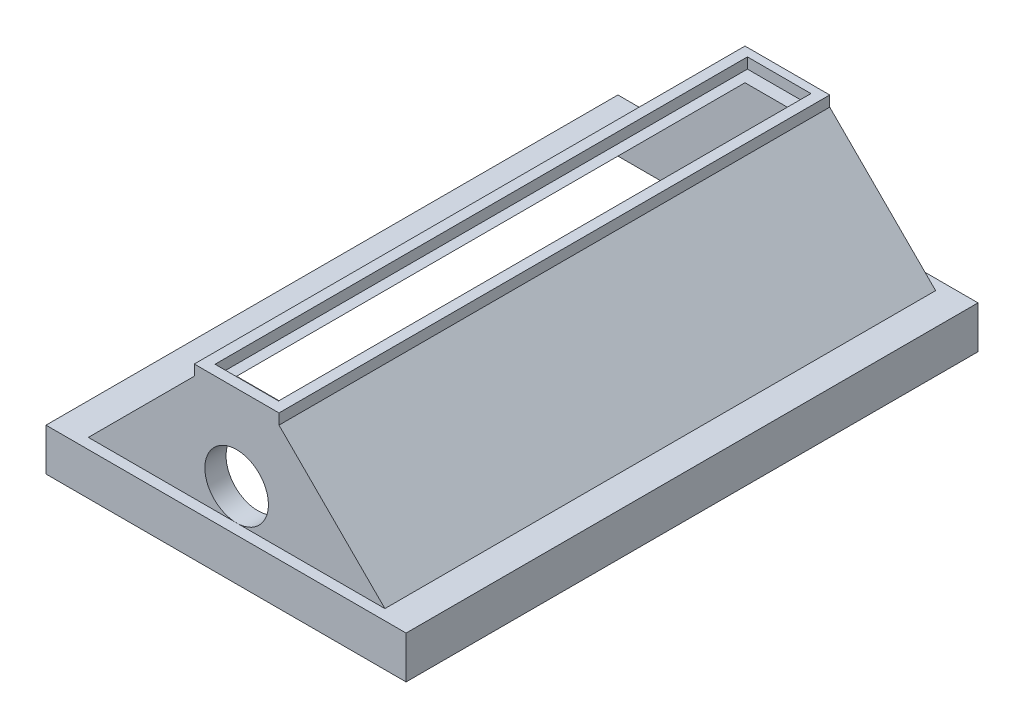
ISO-10303-21;
HEADER;
FILE_DESCRIPTION(('STEP AP214'),'2;1');
FILE_NAME('part.step','',(''),(''),'','','');
FILE_SCHEMA(('AUTOMOTIVE_DESIGN { 1 0 10303 214 1 1 1 1 }'));
ENDSEC;
DATA;
#1=APPLICATION_CONTEXT('core data for automotive mechanical design processes');
#2=APPLICATION_PROTOCOL_DEFINITION('international standard','automotive_design',2000,#1);
#3=PRODUCT_CONTEXT('',#1,'mechanical');
#4=PRODUCT('Part','Part','',(#3));
#5=PRODUCT_RELATED_PRODUCT_CATEGORY('part','',(#4));
#6=PRODUCT_DEFINITION_FORMATION('','',#4);
#7=PRODUCT_DEFINITION_CONTEXT('part definition',#1,'design');
#8=PRODUCT_DEFINITION('design','',#6,#7);
#9=PRODUCT_DEFINITION_SHAPE('','',#8);
#10=(LENGTH_UNIT() NAMED_UNIT(*) SI_UNIT(.MILLI.,.METRE.));
#11=(NAMED_UNIT(*) PLANE_ANGLE_UNIT() SI_UNIT($,.RADIAN.));
#12=(NAMED_UNIT(*) SI_UNIT($,.STERADIAN.) SOLID_ANGLE_UNIT());
#13=UNCERTAINTY_MEASURE_WITH_UNIT(LENGTH_MEASURE(1.E-05),#10,'distance_accuracy_value','');
#14=(GEOMETRIC_REPRESENTATION_CONTEXT(3) GLOBAL_UNCERTAINTY_ASSIGNED_CONTEXT((#13)) GLOBAL_UNIT_ASSIGNED_CONTEXT((#10,
#11,#12)) REPRESENTATION_CONTEXT('',''));
#15=CARTESIAN_POINT('',(0.,0.,0.));
#16=DIRECTION('',(0.,0.,1.));
#17=DIRECTION('',(1.,0.,0.));
#18=AXIS2_PLACEMENT_3D('',#15,#16,#17);
#19=CARTESIAN_POINT('',(0.,0.,0.));
#20=DIRECTION('',(0.,0.,1.));
#21=DIRECTION('',(1.,0.,0.));
#22=AXIS2_PLACEMENT_3D('',#19,#20,#21);
#23=PLANE('',#22);
#24=CARTESIAN_POINT('',(0.,0.,0.));
#25=DIRECTION('',(0.,0.,1.));
#26=DIRECTION('',(1.,0.,0.));
#27=AXIS2_PLACEMENT_3D('',#24,#25,#26);
#28=CIRCLE('',#27,7.5);
#29=CARTESIAN_POINT('',(7.5,0.,0.));
#30=VERTEX_POINT('',#29);
#31=EDGE_CURVE('E341',#30,#30,#28,.T.);
#32=ORIENTED_EDGE('',*,*,#31,.T.);
#33=EDGE_LOOP('',(#32));
#34=FACE_BOUND('',#33,.T.);
#35=DIRECTION('',(1.,0.,0.));
#36=VECTOR('',#35,1.);
#37=CARTESIAN_POINT('',(0.,17.5,0.));
#38=LINE('',#37,#36);
#39=CARTESIAN_POINT('',(-5.,17.5,0.));
#40=VERTEX_POINT('',#39);
#41=CARTESIAN_POINT('',(4.99999999999999,17.5,0.));
#42=VERTEX_POINT('',#41);
#43=EDGE_CURVE('E355',#40,#42,#38,.T.);
#44=ORIENTED_EDGE('',*,*,#43,.T.);
#45=DIRECTION('',(-0.707106781186548,0.707106781186548,0.));
#46=VECTOR('',#45,1.);
#47=CARTESIAN_POINT('',(11.25,11.25,0.));
#48=LINE('',#47,#46);
#49=CARTESIAN_POINT('',(35.,-12.5,0.));
#50=VERTEX_POINT('',#49);
#51=EDGE_CURVE('E330',#50,#42,#48,.T.);
#52=ORIENTED_EDGE('',*,*,#51,.F.);
#53=DIRECTION('',(1.,0.,0.));
#54=VECTOR('',#53,1.);
#55=CARTESIAN_POINT('',(0.,-12.5,0.));
#56=LINE('',#55,#54);
#57=CARTESIAN_POINT('',(-35.,-12.5,0.));
#58=VERTEX_POINT('',#57);
#59=EDGE_CURVE('E346',#58,#50,#56,.T.);
#60=ORIENTED_EDGE('',*,*,#59,.F.);
#61=DIRECTION('',(0.707106781186547,0.707106781186547,0.));
#62=VECTOR('',#61,1.);
#63=CARTESIAN_POINT('',(-35.,-12.5,0.));
#64=LINE('',#63,#62);
#65=EDGE_CURVE('E328',#58,#40,#64,.T.);
#66=ORIENTED_EDGE('',*,*,#65,.T.);
#67=EDGE_LOOP('',(#44,#52,#60,#66));
#68=FACE_BOUND('',#67,.T.);
#69=ADVANCED_FACE('F35',(#34,#68),#23,.F.);
#70=CARTESIAN_POINT('',(0.,17.5,5.));
#71=DIRECTION('',(0.,1.,0.));
#72=DIRECTION('',(0.,0.,1.));
#73=AXIS2_PLACEMENT_3D('',#70,#71,#72);
#74=PLANE('',#73);
#75=DIRECTION('',(0.,0.,1.));
#76=VECTOR('',#75,1.);
#77=CARTESIAN_POINT('',(-7.5,17.5,-123.068378786593));
#78=LINE('',#77,#76);
#79=CARTESIAN_POINT('',(-7.5,17.5,-123.068378786593));
#80=VERTEX_POINT('',#79);
#81=CARTESIAN_POINT('',(-7.49999999999998,17.5,2.60206914676571));
#82=VERTEX_POINT('',#81);
#83=EDGE_CURVE('E50',#80,#82,#78,.T.);
#84=ORIENTED_EDGE('',*,*,#83,.T.);
#85=DIRECTION('',(1.,0.,0.));
#86=VECTOR('',#85,1.);
#87=CARTESIAN_POINT('',(-7.49999999999998,17.5,2.60206914676571));
#88=LINE('',#87,#86);
#89=CARTESIAN_POINT('',(7.50000000000001,17.5,2.60206914676571));
#90=VERTEX_POINT('',#89);
#91=EDGE_CURVE('E54',#82,#90,#88,.T.);
#92=ORIENTED_EDGE('',*,*,#91,.T.);
#93=DIRECTION('',(0.,0.,-1.));
#94=VECTOR('',#93,1.);
#95=CARTESIAN_POINT('',(7.49999999999999,17.5,-123.068378786593));
#96=LINE('',#95,#94);
#97=CARTESIAN_POINT('',(7.49999999999999,17.5,-123.068378786593));
#98=VERTEX_POINT('',#97);
#99=EDGE_CURVE('E215',#90,#98,#96,.T.);
#100=ORIENTED_EDGE('',*,*,#99,.T.);
#101=DIRECTION('',(-1.,0.,0.));
#102=VECTOR('',#101,1.);
#103=CARTESIAN_POINT('',(-7.5,17.5,-123.068378786593));
#104=LINE('',#103,#102);
#105=EDGE_CURVE('E196',#98,#80,#104,.T.);
#106=ORIENTED_EDGE('',*,*,#105,.T.);
#107=EDGE_LOOP('',(#84,#92,#100,#106));
#108=FACE_BOUND('',#107,.T.);
#109=ORIENTED_EDGE('',*,*,#43,.F.);
#110=DIRECTION('',(0.,0.,1.));
#111=VECTOR('',#110,1.);
#112=CARTESIAN_POINT('',(-5.,17.5,-120.));
#113=LINE('',#112,#111);
#114=CARTESIAN_POINT('',(-5.,17.5,-120.));
#115=VERTEX_POINT('',#114);
#116=EDGE_CURVE('E316',#115,#40,#113,.T.);
#117=ORIENTED_EDGE('',*,*,#116,.F.);
#118=DIRECTION('',(1.,0.,0.));
#119=VECTOR('',#118,1.);
#120=CARTESIAN_POINT('',(-10.,17.5,-120.));
#121=LINE('',#120,#119);
#122=CARTESIAN_POINT('',(4.99999999999999,17.5,-120.));
#123=VERTEX_POINT('',#122);
#124=EDGE_CURVE('E313',#115,#123,#121,.T.);
#125=ORIENTED_EDGE('',*,*,#124,.T.);
#126=DIRECTION('',(0.,0.,1.));
#127=VECTOR('',#126,1.);
#128=CARTESIAN_POINT('',(4.99999999999999,17.5,-120.));
#129=LINE('',#128,#127);
#130=EDGE_CURVE('E334',#123,#42,#129,.T.);
#131=ORIENTED_EDGE('',*,*,#130,.T.);
#132=EDGE_LOOP('',(#109,#117,#125,#131));
#133=FACE_BOUND('',#132,.T.);
#134=ADVANCED_FACE('F403',(#108,#133),#74,.T.);
#135=CARTESIAN_POINT('',(-13.75,13.75,5.));
#136=DIRECTION('',(0.707106781186548,-0.707106781186548,0.));
#137=DIRECTION('',(0.707106781186548,0.707106781186548,0.));
#138=AXIS2_PLACEMENT_3D('',#135,#136,#137);
#139=PLANE('',#138);
#140=DIRECTION('',(0.707106781186547,0.707106781186547,0.));
#141=VECTOR('',#140,1.);
#142=CARTESIAN_POINT('',(-40.,-12.5,-125.));
#143=LINE('',#142,#141);
#144=CARTESIAN_POINT('',(-35.,-7.5,-125.));
#145=VERTEX_POINT('',#144);
#146=CARTESIAN_POINT('',(-10.,17.5,-125.));
#147=VERTEX_POINT('',#146);
#148=EDGE_CURVE('E312',#145,#147,#143,.T.);
#149=ORIENTED_EDGE('',*,*,#148,.F.);
#150=DIRECTION('',(0.,0.,-1.));
#151=VECTOR('',#150,1.);
#152=CARTESIAN_POINT('',(-35.,-7.5,0.));
#153=LINE('',#152,#151);
#154=CARTESIAN_POINT('',(-35.,-7.5,5.));
#155=VERTEX_POINT('',#154);
#156=EDGE_CURVE('E281',#155,#145,#153,.T.);
#157=ORIENTED_EDGE('',*,*,#156,.F.);
#158=DIRECTION('',(-0.707106781186548,-0.707106781186548,0.));
#159=VECTOR('',#158,1.);
#160=CARTESIAN_POINT('',(-13.75,13.75,5.));
#161=LINE('',#160,#159);
#162=CARTESIAN_POINT('',(-10.,17.5,5.));
#163=VERTEX_POINT('',#162);
#164=EDGE_CURVE('E345',#163,#155,#161,.T.);
#165=ORIENTED_EDGE('',*,*,#164,.F.);
#166=DIRECTION('',(0.,0.,-1.));
#167=VECTOR('',#166,1.);
#168=CARTESIAN_POINT('',(-10.,17.5,5.));
#169=LINE('',#168,#167);
#170=EDGE_CURVE('E43',#163,#147,#169,.T.);
#171=ORIENTED_EDGE('',*,*,#170,.T.);
#172=EDGE_LOOP('',(#149,#157,#165,#171));
#173=FACE_BOUND('',#172,.T.);
#174=ADVANCED_FACE('F365',(#173),#139,.F.);
#175=CARTESIAN_POINT('',(0.,-12.5,5.));
#176=DIRECTION('',(0.,1.,0.));
#177=DIRECTION('',(0.,0.,1.));
#178=AXIS2_PLACEMENT_3D('',#175,#176,#177);
#179=PLANE('',#178);
#180=DIRECTION('',(-1.,0.,0.));
#181=VECTOR('',#180,1.);
#182=CARTESIAN_POINT('',(-40.05,-12.5,5.04999999999999));
#183=LINE('',#182,#181);
#184=CARTESIAN_POINT('',(40.05,-12.5,5.05));
#185=VERTEX_POINT('',#184);
#186=CARTESIAN_POINT('',(-40.05,-12.5,5.04999999999999));
#187=VERTEX_POINT('',#186);
#188=EDGE_CURVE('E243',#185,#187,#183,.T.);
#189=ORIENTED_EDGE('',*,*,#188,.T.);
#190=DIRECTION('',(0.,0.,-1.));
#191=VECTOR('',#190,1.);
#192=CARTESIAN_POINT('',(-40.05,-12.5,-125.05));
#193=LINE('',#192,#191);
#194=CARTESIAN_POINT('',(-40.05,-12.5,-125.05));
#195=VERTEX_POINT('',#194);
#196=EDGE_CURVE('E239',#187,#195,#193,.T.);
#197=ORIENTED_EDGE('',*,*,#196,.T.);
#198=DIRECTION('',(1.,0.,0.));
#199=VECTOR('',#198,1.);
#200=CARTESIAN_POINT('',(-40.05,-12.5,-125.05));
#201=LINE('',#200,#199);
#202=CARTESIAN_POINT('',(40.05,-12.5,-125.05));
#203=VERTEX_POINT('',#202);
#204=EDGE_CURVE('E253',#195,#203,#201,.T.);
#205=ORIENTED_EDGE('',*,*,#204,.T.);
#206=DIRECTION('',(0.,0.,1.));
#207=VECTOR('',#206,1.);
#208=CARTESIAN_POINT('',(40.05,-12.5,-125.05));
#209=LINE('',#208,#207);
#210=EDGE_CURVE('E256',#203,#185,#209,.T.);
#211=ORIENTED_EDGE('',*,*,#210,.T.);
#212=EDGE_LOOP('',(#189,#197,#205,#211));
#213=FACE_BOUND('',#212,.T.);
#214=DIRECTION('',(0.,0.,1.));
#215=VECTOR('',#214,1.);
#216=CARTESIAN_POINT('',(35.,-12.5,-120.));
#217=LINE('',#216,#215);
#218=CARTESIAN_POINT('',(35.,-12.5,-120.));
#219=VERTEX_POINT('',#218);
#220=EDGE_CURVE('E338',#219,#50,#217,.T.);
#221=ORIENTED_EDGE('',*,*,#220,.F.);
#222=DIRECTION('',(-1.,0.,0.));
#223=VECTOR('',#222,1.);
#224=CARTESIAN_POINT('',(40.,-12.5,-120.));
#225=LINE('',#224,#223);
#226=CARTESIAN_POINT('',(-35.,-12.5,-120.));
#227=VERTEX_POINT('',#226);
#228=EDGE_CURVE('E317',#219,#227,#225,.T.);
#229=ORIENTED_EDGE('',*,*,#228,.T.);
#230=DIRECTION('',(0.,0.,1.));
#231=VECTOR('',#230,1.);
#232=CARTESIAN_POINT('',(-35.,-12.5,-120.));
#233=LINE('',#232,#231);
#234=EDGE_CURVE('E322',#227,#58,#233,.T.);
#235=ORIENTED_EDGE('',*,*,#234,.T.);
#236=ORIENTED_EDGE('',*,*,#59,.T.);
#237=EDGE_LOOP('',(#221,#229,#235,#236));
#238=FACE_BOUND('',#237,.T.);
#239=ADVANCED_FACE('F391',(#213,#238),#179,.F.);
#240=CARTESIAN_POINT('',(0.,0.,5.));
#241=DIRECTION('',(0.,0.,-1.));
#242=DIRECTION('',(-1.,0.,0.));
#243=AXIS2_PLACEMENT_3D('',#240,#241,#242);
#244=CYLINDRICAL_SURFACE('',#243,7.5);
#245=ORIENTED_EDGE('',*,*,#31,.F.);
#246=EDGE_LOOP('',(#245));
#247=FACE_BOUND('',#246,.T.);
#248=CARTESIAN_POINT('',(0.,0.,5.));
#249=DIRECTION('',(0.,0.,1.));
#250=DIRECTION('',(1.,0.,0.));
#251=AXIS2_PLACEMENT_3D('',#248,#249,#250);
#252=CIRCLE('',#251,7.5);
#253=CARTESIAN_POINT('',(0.,-7.5,5.));
#254=VERTEX_POINT('',#253);
#255=EDGE_CURVE('E342',#254,#254,#252,.T.);
#256=ORIENTED_EDGE('',*,*,#255,.T.);
#257=EDGE_LOOP('',(#256));
#258=FACE_BOUND('',#257,.T.);
#259=ADVANCED_FACE('F37',(#247,#258),#244,.F.);
#260=CARTESIAN_POINT('',(13.75,13.75,5.));
#261=DIRECTION('',(0.707106781186548,0.707106781186548,0.));
#262=DIRECTION('',(-0.707106781186548,0.707106781186548,0.));
#263=AXIS2_PLACEMENT_3D('',#260,#261,#262);
#264=PLANE('',#263);
#265=DIRECTION('',(0.,0.,1.));
#266=VECTOR('',#265,1.);
#267=CARTESIAN_POINT('',(35.,-7.5,5.));
#268=LINE('',#267,#266);
#269=CARTESIAN_POINT('',(35.,-7.49999999999999,-125.));
#270=VERTEX_POINT('',#269);
#271=CARTESIAN_POINT('',(35.,-7.5,5.));
#272=VERTEX_POINT('',#271);
#273=EDGE_CURVE('E298',#270,#272,#268,.T.);
#274=ORIENTED_EDGE('',*,*,#273,.F.);
#275=DIRECTION('',(0.707106781186547,-0.707106781186548,0.));
#276=VECTOR('',#275,1.);
#277=CARTESIAN_POINT('',(10.,17.5,-125.));
#278=LINE('',#277,#276);
#279=CARTESIAN_POINT('',(10.,17.5,-125.));
#280=VERTEX_POINT('',#279);
#281=EDGE_CURVE('E309',#280,#270,#278,.T.);
#282=ORIENTED_EDGE('',*,*,#281,.F.);
#283=DIRECTION('',(0.,0.,-1.));
#284=VECTOR('',#283,1.);
#285=CARTESIAN_POINT('',(10.,17.5,5.));
#286=LINE('',#285,#284);
#287=CARTESIAN_POINT('',(10.,17.5,5.));
#288=VERTEX_POINT('',#287);
#289=EDGE_CURVE('E352',#288,#280,#286,.T.);
#290=ORIENTED_EDGE('',*,*,#289,.F.);
#291=DIRECTION('',(0.707106781186548,-0.707106781186548,0.));
#292=VECTOR('',#291,1.);
#293=CARTESIAN_POINT('',(13.75,13.75,5.));
#294=LINE('',#293,#292);
#295=EDGE_CURVE('E349',#288,#272,#294,.T.);
#296=ORIENTED_EDGE('',*,*,#295,.T.);
#297=EDGE_LOOP('',(#274,#282,#290,#296));
#298=FACE_BOUND('',#297,.T.);
#299=ADVANCED_FACE('F380',(#298),#264,.T.);
#300=CARTESIAN_POINT('',(0.,0.,5.));
#301=DIRECTION('',(0.,0.,1.));
#302=DIRECTION('',(1.,0.,0.));
#303=AXIS2_PLACEMENT_3D('',#300,#301,#302);
#304=PLANE('',#303);
#305=DIRECTION('',(-1.,0.,0.));
#306=VECTOR('',#305,1.);
#307=CARTESIAN_POINT('',(0.,-7.5,5.));
#308=LINE('',#307,#306);
#309=EDGE_CURVE('E308',#272,#254,#308,.T.);
#310=ORIENTED_EDGE('',*,*,#309,.F.);
#311=ORIENTED_EDGE('',*,*,#295,.F.);
#312=DIRECTION('',(0.,-1.,0.));
#313=VECTOR('',#312,1.);
#314=CARTESIAN_POINT('',(10.,20.,5.));
#315=LINE('',#314,#313);
#316=CARTESIAN_POINT('',(10.,20.,5.));
#317=VERTEX_POINT('',#316);
#318=EDGE_CURVE('E235',#317,#288,#315,.T.);
#319=ORIENTED_EDGE('',*,*,#318,.F.);
#320=DIRECTION('',(1.,0.,0.));
#321=VECTOR('',#320,1.);
#322=CARTESIAN_POINT('',(-10.,20.,5.));
#323=LINE('',#322,#321);
#324=CARTESIAN_POINT('',(-10.,20.,5.));
#325=VERTEX_POINT('',#324);
#326=EDGE_CURVE('E225',#325,#317,#323,.T.);
#327=ORIENTED_EDGE('',*,*,#326,.F.);
#328=DIRECTION('',(0.,-1.,0.));
#329=VECTOR('',#328,1.);
#330=CARTESIAN_POINT('',(-10.,20.,5.));
#331=LINE('',#330,#329);
#332=EDGE_CURVE('E237',#325,#163,#331,.T.);
#333=ORIENTED_EDGE('',*,*,#332,.T.);
#334=ORIENTED_EDGE('',*,*,#164,.T.);
#335=EDGE_CURVE('E305',#254,#155,#308,.T.);
#336=ORIENTED_EDGE('',*,*,#335,.F.);
#337=ORIENTED_EDGE('',*,*,#255,.F.);
#338=EDGE_LOOP('',(#310,#311,#319,#327,#333,#334,#336,#337));
#339=FACE_BOUND('',#338,.T.);
#340=ADVANCED_FACE('F385',(#339),#304,.T.);
#341=CARTESIAN_POINT('',(11.25,11.25,-120.));
#342=DIRECTION('',(0.707106781186547,0.707106781186547,0.));
#343=DIRECTION('',(-0.707106781186548,0.707106781186548,0.));
#344=AXIS2_PLACEMENT_3D('',#341,#342,#343);
#345=PLANE('',#344);
#346=ORIENTED_EDGE('',*,*,#51,.T.);
#347=ORIENTED_EDGE('',*,*,#130,.F.);
#348=DIRECTION('',(-0.707106781186548,0.707106781186548,0.));
#349=VECTOR('',#348,1.);
#350=CARTESIAN_POINT('',(11.25,11.25,-120.));
#351=LINE('',#350,#349);
#352=EDGE_CURVE('E332',#219,#123,#351,.T.);
#353=ORIENTED_EDGE('',*,*,#352,.F.);
#354=ORIENTED_EDGE('',*,*,#220,.T.);
#355=EDGE_LOOP('',(#346,#347,#353,#354));
#356=FACE_BOUND('',#355,.T.);
#357=ADVANCED_FACE('F430',(#356),#345,.F.);
#358=CARTESIAN_POINT('',(-35.,-12.5,-120.));
#359=DIRECTION('',(0.707106781186547,-0.707106781186547,0.));
#360=DIRECTION('',(0.707106781186548,0.707106781186548,0.));
#361=AXIS2_PLACEMENT_3D('',#358,#359,#360);
#362=PLANE('',#361);
#363=ORIENTED_EDGE('',*,*,#65,.F.);
#364=ORIENTED_EDGE('',*,*,#234,.F.);
#365=DIRECTION('',(0.707106781186547,0.707106781186547,0.));
#366=VECTOR('',#365,1.);
#367=CARTESIAN_POINT('',(-35.,-12.5,-120.));
#368=LINE('',#367,#366);
#369=EDGE_CURVE('E325',#227,#115,#368,.T.);
#370=ORIENTED_EDGE('',*,*,#369,.T.);
#371=ORIENTED_EDGE('',*,*,#116,.T.);
#372=EDGE_LOOP('',(#363,#364,#370,#371));
#373=FACE_BOUND('',#372,.T.);
#374=ADVANCED_FACE('F551',(#373),#362,.T.);
#375=CARTESIAN_POINT('',(0.,0.,-120.));
#376=DIRECTION('',(0.,0.,1.));
#377=DIRECTION('',(1.,0.,0.));
#378=AXIS2_PLACEMENT_3D('',#375,#376,#377);
#379=PLANE('',#378);
#380=ORIENTED_EDGE('',*,*,#124,.F.);
#381=ORIENTED_EDGE('',*,*,#369,.F.);
#382=ORIENTED_EDGE('',*,*,#228,.F.);
#383=ORIENTED_EDGE('',*,*,#352,.T.);
#384=EDGE_LOOP('',(#380,#381,#382,#383));
#385=FACE_BOUND('',#384,.T.);
#386=ADVANCED_FACE('F441',(#385),#379,.T.);
#387=CARTESIAN_POINT('',(0.,0.,-125.));
#388=DIRECTION('',(0.,0.,1.));
#389=DIRECTION('',(1.,0.,0.));
#390=AXIS2_PLACEMENT_3D('',#387,#388,#389);
#391=PLANE('',#390);
#392=ORIENTED_EDGE('',*,*,#281,.T.);
#393=DIRECTION('',(-1.,0.,0.));
#394=VECTOR('',#393,1.);
#395=CARTESIAN_POINT('',(0.,-7.5,-125.));
#396=LINE('',#395,#394);
#397=EDGE_CURVE('E11',#270,#145,#396,.T.);
#398=ORIENTED_EDGE('',*,*,#397,.T.);
#399=ORIENTED_EDGE('',*,*,#148,.T.);
#400=DIRECTION('',(0.,-1.,0.));
#401=VECTOR('',#400,1.);
#402=CARTESIAN_POINT('',(-10.,20.,-125.));
#403=LINE('',#402,#401);
#404=CARTESIAN_POINT('',(-10.,20.,-125.));
#405=VERTEX_POINT('',#404);
#406=EDGE_CURVE('E231',#405,#147,#403,.T.);
#407=ORIENTED_EDGE('',*,*,#406,.F.);
#408=DIRECTION('',(-1.,0.,0.));
#409=VECTOR('',#408,1.);
#410=CARTESIAN_POINT('',(-10.,20.,-125.));
#411=LINE('',#410,#409);
#412=CARTESIAN_POINT('',(10.,20.,-125.));
#413=VERTEX_POINT('',#412);
#414=EDGE_CURVE('E229',#413,#405,#411,.T.);
#415=ORIENTED_EDGE('',*,*,#414,.F.);
#416=DIRECTION('',(0.,-1.,0.));
#417=VECTOR('',#416,1.);
#418=CARTESIAN_POINT('',(10.,20.,-125.));
#419=LINE('',#418,#417);
#420=EDGE_CURVE('E233',#413,#280,#419,.T.);
#421=ORIENTED_EDGE('',*,*,#420,.T.);
#422=EDGE_LOOP('',(#392,#398,#399,#407,#415,#421));
#423=FACE_BOUND('',#422,.T.);
#424=ADVANCED_FACE('F373',(#423),#391,.F.);
#425=CARTESIAN_POINT('',(0.,-7.5,0.));
#426=DIRECTION('',(0.,1.,0.));
#427=DIRECTION('',(0.,0.,1.));
#428=AXIS2_PLACEMENT_3D('',#425,#426,#427);
#429=PLANE('',#428);
#430=DIRECTION('',(0.,0.,1.));
#431=VECTOR('',#430,1.);
#432=CARTESIAN_POINT('',(42.5,-7.5,7.5));
#433=LINE('',#432,#431);
#434=CARTESIAN_POINT('',(42.5,-7.5,-127.5));
#435=VERTEX_POINT('',#434);
#436=CARTESIAN_POINT('',(42.5,-7.5,7.5));
#437=VERTEX_POINT('',#436);
#438=EDGE_CURVE('E283',#435,#437,#433,.T.);
#439=ORIENTED_EDGE('',*,*,#438,.F.);
#440=DIRECTION('',(1.,0.,0.));
#441=VECTOR('',#440,1.);
#442=CARTESIAN_POINT('',(42.5,-7.5,-127.5));
#443=LINE('',#442,#441);
#444=CARTESIAN_POINT('',(-42.5,-7.5,-127.5));
#445=VERTEX_POINT('',#444);
#446=EDGE_CURVE('E292',#445,#435,#443,.T.);
#447=ORIENTED_EDGE('',*,*,#446,.F.);
#448=DIRECTION('',(0.,0.,-1.));
#449=VECTOR('',#448,1.);
#450=CARTESIAN_POINT('',(-42.5,-7.5,7.5));
#451=LINE('',#450,#449);
#452=CARTESIAN_POINT('',(-42.5,-7.5,7.5));
#453=VERTEX_POINT('',#452);
#454=EDGE_CURVE('E289',#453,#445,#451,.T.);
#455=ORIENTED_EDGE('',*,*,#454,.F.);
#456=DIRECTION('',(-1.,0.,0.));
#457=VECTOR('',#456,1.);
#458=CARTESIAN_POINT('',(42.5,-7.5,7.5));
#459=LINE('',#458,#457);
#460=EDGE_CURVE('E286',#437,#453,#459,.T.);
#461=ORIENTED_EDGE('',*,*,#460,.F.);
#462=EDGE_LOOP('',(#439,#447,#455,#461));
#463=FACE_BOUND('',#462,.T.);
#464=ORIENTED_EDGE('',*,*,#335,.T.);
#465=ORIENTED_EDGE('',*,*,#156,.T.);
#466=ORIENTED_EDGE('',*,*,#397,.F.);
#467=ORIENTED_EDGE('',*,*,#273,.T.);
#468=ORIENTED_EDGE('',*,*,#309,.T.);
#469=EDGE_LOOP('',(#464,#465,#466,#467,#468));
#470=FACE_BOUND('',#469,.T.);
#471=ADVANCED_FACE('F377',(#463,#470),#429,.T.);
#472=CARTESIAN_POINT('',(42.5,-7.5,7.5));
#473=DIRECTION('',(1.,0.,0.));
#474=DIRECTION('',(0.,0.,-1.));
#475=AXIS2_PLACEMENT_3D('',#472,#473,#474);
#476=PLANE('',#475);
#477=DIRECTION('',(0.,-1.,0.));
#478=VECTOR('',#477,1.);
#479=CARTESIAN_POINT('',(42.5,-7.5,7.5));
#480=LINE('',#479,#478);
#481=CARTESIAN_POINT('',(42.5,-17.5,7.5));
#482=VERTEX_POINT('',#481);
#483=EDGE_CURVE('E295',#437,#482,#480,.T.);
#484=ORIENTED_EDGE('',*,*,#483,.T.);
#485=DIRECTION('',(0.,0.,1.));
#486=VECTOR('',#485,1.);
#487=CARTESIAN_POINT('',(42.5,-17.5,-127.5));
#488=LINE('',#487,#486);
#489=CARTESIAN_POINT('',(42.5,-17.5,-127.5));
#490=VERTEX_POINT('',#489);
#491=EDGE_CURVE('E275',#490,#482,#488,.T.);
#492=ORIENTED_EDGE('',*,*,#491,.F.);
#493=DIRECTION('',(0.,-1.,0.));
#494=VECTOR('',#493,1.);
#495=CARTESIAN_POINT('',(42.5,-7.5,-127.5));
#496=LINE('',#495,#494);
#497=EDGE_CURVE('E296',#435,#490,#496,.T.);
#498=ORIENTED_EDGE('',*,*,#497,.F.);
#499=ORIENTED_EDGE('',*,*,#438,.T.);
#500=EDGE_LOOP('',(#484,#492,#498,#499));
#501=FACE_BOUND('',#500,.T.);
#502=ADVANCED_FACE('F533',(#501),#476,.T.);
#503=CARTESIAN_POINT('',(42.5,-7.5,-127.5));
#504=DIRECTION('',(0.,0.,-1.));
#505=DIRECTION('',(-1.,0.,0.));
#506=AXIS2_PLACEMENT_3D('',#503,#504,#505);
#507=PLANE('',#506);
#508=ORIENTED_EDGE('',*,*,#497,.T.);
#509=DIRECTION('',(1.,0.,0.));
#510=VECTOR('',#509,1.);
#511=CARTESIAN_POINT('',(-42.5,-17.5,-127.5));
#512=LINE('',#511,#510);
#513=CARTESIAN_POINT('',(-42.5,-17.5,-127.5));
#514=VERTEX_POINT('',#513);
#515=EDGE_CURVE('E272',#514,#490,#512,.T.);
#516=ORIENTED_EDGE('',*,*,#515,.F.);
#517=DIRECTION('',(0.,-1.,0.));
#518=VECTOR('',#517,1.);
#519=CARTESIAN_POINT('',(-42.5,-7.5,-127.5));
#520=LINE('',#519,#518);
#521=EDGE_CURVE('E299',#445,#514,#520,.T.);
#522=ORIENTED_EDGE('',*,*,#521,.F.);
#523=ORIENTED_EDGE('',*,*,#446,.T.);
#524=EDGE_LOOP('',(#508,#516,#522,#523));
#525=FACE_BOUND('',#524,.T.);
#526=ADVANCED_FACE('F535',(#525),#507,.T.);
#527=CARTESIAN_POINT('',(-42.5,-7.5,7.5));
#528=DIRECTION('',(-1.,0.,0.));
#529=DIRECTION('',(0.,0.,1.));
#530=AXIS2_PLACEMENT_3D('',#527,#528,#529);
#531=PLANE('',#530);
#532=ORIENTED_EDGE('',*,*,#521,.T.);
#533=DIRECTION('',(0.,0.,-1.));
#534=VECTOR('',#533,1.);
#535=CARTESIAN_POINT('',(-42.5,-17.5,-127.5));
#536=LINE('',#535,#534);
#537=CARTESIAN_POINT('',(-42.5,-17.5,7.5));
#538=VERTEX_POINT('',#537);
#539=EDGE_CURVE('E269',#538,#514,#536,.T.);
#540=ORIENTED_EDGE('',*,*,#539,.F.);
#541=DIRECTION('',(0.,-1.,0.));
#542=VECTOR('',#541,1.);
#543=CARTESIAN_POINT('',(-42.5,-7.5,7.5));
#544=LINE('',#543,#542);
#545=EDGE_CURVE('E301',#453,#538,#544,.T.);
#546=ORIENTED_EDGE('',*,*,#545,.F.);
#547=ORIENTED_EDGE('',*,*,#454,.T.);
#548=EDGE_LOOP('',(#532,#540,#546,#547));
#549=FACE_BOUND('',#548,.T.);
#550=ADVANCED_FACE('F538',(#549),#531,.T.);
#551=CARTESIAN_POINT('',(42.5,-7.5,7.5));
#552=DIRECTION('',(0.,0.,1.));
#553=DIRECTION('',(1.,0.,0.));
#554=AXIS2_PLACEMENT_3D('',#551,#552,#553);
#555=PLANE('',#554);
#556=ORIENTED_EDGE('',*,*,#545,.T.);
#557=DIRECTION('',(-1.,0.,0.));
#558=VECTOR('',#557,1.);
#559=CARTESIAN_POINT('',(-42.5,-17.5,7.5));
#560=LINE('',#559,#558);
#561=EDGE_CURVE('E278',#482,#538,#560,.T.);
#562=ORIENTED_EDGE('',*,*,#561,.F.);
#563=ORIENTED_EDGE('',*,*,#483,.F.);
#564=ORIENTED_EDGE('',*,*,#460,.T.);
#565=EDGE_LOOP('',(#556,#562,#563,#564));
#566=FACE_BOUND('',#565,.T.);
#567=ADVANCED_FACE('F529',(#566),#555,.T.);
#568=CARTESIAN_POINT('',(0.,-17.5,0.));
#569=DIRECTION('',(0.,1.,0.));
#570=DIRECTION('',(0.,0.,1.));
#571=AXIS2_PLACEMENT_3D('',#568,#569,#570);
#572=PLANE('',#571);
#573=ORIENTED_EDGE('',*,*,#539,.T.);
#574=ORIENTED_EDGE('',*,*,#515,.T.);
#575=ORIENTED_EDGE('',*,*,#491,.T.);
#576=ORIENTED_EDGE('',*,*,#561,.T.);
#577=EDGE_LOOP('',(#573,#574,#575,#576));
#578=FACE_BOUND('',#577,.T.);
#579=DIRECTION('',(0.,0.,-1.));
#580=VECTOR('',#579,1.);
#581=CARTESIAN_POINT('',(-40.05,-17.5,-125.05));
#582=LINE('',#581,#580);
#583=CARTESIAN_POINT('',(-40.05,-17.5,5.04999999999999));
#584=VERTEX_POINT('',#583);
#585=CARTESIAN_POINT('',(-40.05,-17.5,-125.05));
#586=VERTEX_POINT('',#585);
#587=EDGE_CURVE('E240',#584,#586,#582,.T.);
#588=ORIENTED_EDGE('',*,*,#587,.F.);
#589=DIRECTION('',(-1.,0.,0.));
#590=VECTOR('',#589,1.);
#591=CARTESIAN_POINT('',(-40.05,-17.5,5.04999999999999));
#592=LINE('',#591,#590);
#593=CARTESIAN_POINT('',(40.05,-17.5,5.05));
#594=VERTEX_POINT('',#593);
#595=EDGE_CURVE('E248',#594,#584,#592,.T.);
#596=ORIENTED_EDGE('',*,*,#595,.F.);
#597=DIRECTION('',(0.,0.,1.));
#598=VECTOR('',#597,1.);
#599=CARTESIAN_POINT('',(40.05,-17.5,-125.05));
#600=LINE('',#599,#598);
#601=CARTESIAN_POINT('',(40.05,-17.5,-125.05));
#602=VERTEX_POINT('',#601);
#603=EDGE_CURVE('E245',#602,#594,#600,.T.);
#604=ORIENTED_EDGE('',*,*,#603,.F.);
#605=DIRECTION('',(1.,0.,0.));
#606=VECTOR('',#605,1.);
#607=CARTESIAN_POINT('',(-40.05,-17.5,-125.05));
#608=LINE('',#607,#606);
#609=EDGE_CURVE('E242',#586,#602,#608,.T.);
#610=ORIENTED_EDGE('',*,*,#609,.F.);
#611=EDGE_LOOP('',(#588,#596,#604,#610));
#612=FACE_BOUND('',#611,.T.);
#613=ADVANCED_FACE('F525',(#578,#612),#572,.F.);
#614=CARTESIAN_POINT('',(-40.05,-17.5,-125.05));
#615=DIRECTION('',(1.,0.,0.));
#616=DIRECTION('',(0.,0.,-1.));
#617=AXIS2_PLACEMENT_3D('',#614,#615,#616);
#618=PLANE('',#617);
#619=ORIENTED_EDGE('',*,*,#196,.F.);
#620=DIRECTION('',(0.,1.,0.));
#621=VECTOR('',#620,1.);
#622=CARTESIAN_POINT('',(-40.05,-17.5,5.04999999999999));
#623=LINE('',#622,#621);
#624=EDGE_CURVE('E250',#584,#187,#623,.T.);
#625=ORIENTED_EDGE('',*,*,#624,.F.);
#626=ORIENTED_EDGE('',*,*,#587,.T.);
#627=DIRECTION('',(0.,1.,0.));
#628=VECTOR('',#627,1.);
#629=CARTESIAN_POINT('',(-40.05,-17.5,-125.05));
#630=LINE('',#629,#628);
#631=EDGE_CURVE('E266',#586,#195,#630,.T.);
#632=ORIENTED_EDGE('',*,*,#631,.T.);
#633=EDGE_LOOP('',(#619,#625,#626,#632));
#634=FACE_BOUND('',#633,.T.);
#635=ADVANCED_FACE('F521',(#634),#618,.T.);
#636=CARTESIAN_POINT('',(-40.05,-17.5,-125.05));
#637=DIRECTION('',(0.,0.,1.));
#638=DIRECTION('',(1.,0.,0.));
#639=AXIS2_PLACEMENT_3D('',#636,#637,#638);
#640=PLANE('',#639);
#641=ORIENTED_EDGE('',*,*,#204,.F.);
#642=ORIENTED_EDGE('',*,*,#631,.F.);
#643=ORIENTED_EDGE('',*,*,#609,.T.);
#644=DIRECTION('',(0.,1.,0.));
#645=VECTOR('',#644,1.);
#646=CARTESIAN_POINT('',(40.05,-17.5,-125.05));
#647=LINE('',#646,#645);
#648=EDGE_CURVE('E264',#602,#203,#647,.T.);
#649=ORIENTED_EDGE('',*,*,#648,.T.);
#650=EDGE_LOOP('',(#641,#642,#643,#649));
#651=FACE_BOUND('',#650,.T.);
#652=ADVANCED_FACE('F517',(#651),#640,.T.);
#653=CARTESIAN_POINT('',(40.05,-17.5,-125.05));
#654=DIRECTION('',(-1.,0.,0.));
#655=DIRECTION('',(0.,0.,1.));
#656=AXIS2_PLACEMENT_3D('',#653,#654,#655);
#657=PLANE('',#656);
#658=ORIENTED_EDGE('',*,*,#210,.F.);
#659=ORIENTED_EDGE('',*,*,#648,.F.);
#660=ORIENTED_EDGE('',*,*,#603,.T.);
#661=DIRECTION('',(0.,1.,0.));
#662=VECTOR('',#661,1.);
#663=CARTESIAN_POINT('',(40.05,-17.5,5.05));
#664=LINE('',#663,#662);
#665=EDGE_CURVE('E262',#594,#185,#664,.T.);
#666=ORIENTED_EDGE('',*,*,#665,.T.);
#667=EDGE_LOOP('',(#658,#659,#660,#666));
#668=FACE_BOUND('',#667,.T.);
#669=ADVANCED_FACE('F513',(#668),#657,.T.);
#670=CARTESIAN_POINT('',(-40.05,-17.5,5.04999999999999));
#671=DIRECTION('',(0.,0.,-1.));
#672=DIRECTION('',(-1.,0.,0.));
#673=AXIS2_PLACEMENT_3D('',#670,#671,#672);
#674=PLANE('',#673);
#675=ORIENTED_EDGE('',*,*,#188,.F.);
#676=ORIENTED_EDGE('',*,*,#665,.F.);
#677=ORIENTED_EDGE('',*,*,#595,.T.);
#678=ORIENTED_EDGE('',*,*,#624,.T.);
#679=EDGE_LOOP('',(#675,#676,#677,#678));
#680=FACE_BOUND('',#679,.T.);
#681=ADVANCED_FACE('F451',(#680),#674,.T.);
#682=CARTESIAN_POINT('',(0.,20.,0.));
#683=DIRECTION('',(0.,1.,0.));
#684=DIRECTION('',(0.,0.,1.));
#685=AXIS2_PLACEMENT_3D('',#682,#683,#684);
#686=PLANE('',#685);
#687=DIRECTION('',(0.,0.,1.));
#688=VECTOR('',#687,1.);
#689=CARTESIAN_POINT('',(-10.,20.,-125.));
#690=LINE('',#689,#688);
#691=EDGE_CURVE('E201',#405,#325,#690,.T.);
#692=ORIENTED_EDGE('',*,*,#691,.T.);
#693=ORIENTED_EDGE('',*,*,#326,.T.);
#694=DIRECTION('',(0.,0.,-1.));
#695=VECTOR('',#694,1.);
#696=CARTESIAN_POINT('',(10.,20.,-125.));
#697=LINE('',#696,#695);
#698=EDGE_CURVE('E227',#317,#413,#697,.T.);
#699=ORIENTED_EDGE('',*,*,#698,.T.);
#700=ORIENTED_EDGE('',*,*,#414,.T.);
#701=EDGE_LOOP('',(#692,#693,#699,#700));
#702=FACE_BOUND('',#701,.T.);
#703=DIRECTION('',(1.,0.,0.));
#704=VECTOR('',#703,1.);
#705=CARTESIAN_POINT('',(-7.49999999999998,20.,2.60206914676571));
#706=LINE('',#705,#704);
#707=CARTESIAN_POINT('',(-7.49999999999998,20.,2.60206914676571));
#708=VERTEX_POINT('',#707);
#709=CARTESIAN_POINT('',(7.50000000000001,20.,2.60206914676571));
#710=VERTEX_POINT('',#709);
#711=EDGE_CURVE('E195',#708,#710,#706,.T.);
#712=ORIENTED_EDGE('',*,*,#711,.F.);
#713=DIRECTION('',(0.,0.,1.));
#714=VECTOR('',#713,1.);
#715=CARTESIAN_POINT('',(-7.5,20.,-123.068378786593));
#716=LINE('',#715,#714);
#717=CARTESIAN_POINT('',(-7.5,20.,-123.068378786593));
#718=VERTEX_POINT('',#717);
#719=EDGE_CURVE('E186',#718,#708,#716,.T.);
#720=ORIENTED_EDGE('',*,*,#719,.F.);
#721=DIRECTION('',(-1.,0.,0.));
#722=VECTOR('',#721,1.);
#723=CARTESIAN_POINT('',(-7.5,20.,-123.068378786593));
#724=LINE('',#723,#722);
#725=CARTESIAN_POINT('',(7.49999999999999,20.,-123.068378786593));
#726=VERTEX_POINT('',#725);
#727=EDGE_CURVE('E209',#726,#718,#724,.T.);
#728=ORIENTED_EDGE('',*,*,#727,.F.);
#729=DIRECTION('',(0.,0.,-1.));
#730=VECTOR('',#729,1.);
#731=CARTESIAN_POINT('',(7.49999999999999,20.,-123.068378786593));
#732=LINE('',#731,#730);
#733=EDGE_CURVE('E207',#710,#726,#732,.T.);
#734=ORIENTED_EDGE('',*,*,#733,.F.);
#735=EDGE_LOOP('',(#712,#720,#728,#734));
#736=FACE_BOUND('',#735,.T.);
#737=ADVANCED_FACE('F205',(#702,#736),#686,.T.);
#738=CARTESIAN_POINT('',(-10.,20.,-125.));
#739=DIRECTION('',(1.,0.,0.));
#740=DIRECTION('',(0.,0.,-1.));
#741=AXIS2_PLACEMENT_3D('',#738,#739,#740);
#742=PLANE('',#741);
#743=ORIENTED_EDGE('',*,*,#170,.F.);
#744=ORIENTED_EDGE('',*,*,#332,.F.);
#745=ORIENTED_EDGE('',*,*,#691,.F.);
#746=ORIENTED_EDGE('',*,*,#406,.T.);
#747=EDGE_LOOP('',(#743,#744,#745,#746));
#748=FACE_BOUND('',#747,.T.);
#749=ADVANCED_FACE('F368',(#748),#742,.F.);
#750=CARTESIAN_POINT('',(10.,20.,-125.));
#751=DIRECTION('',(-1.,0.,0.));
#752=DIRECTION('',(0.,0.,1.));
#753=AXIS2_PLACEMENT_3D('',#750,#751,#752);
#754=PLANE('',#753);
#755=ORIENTED_EDGE('',*,*,#289,.T.);
#756=ORIENTED_EDGE('',*,*,#420,.F.);
#757=ORIENTED_EDGE('',*,*,#698,.F.);
#758=ORIENTED_EDGE('',*,*,#318,.T.);
#759=EDGE_LOOP('',(#755,#756,#757,#758));
#760=FACE_BOUND('',#759,.T.);
#761=ADVANCED_FACE('F461',(#760),#754,.F.);
#762=CARTESIAN_POINT('',(-7.5,20.,-123.068378786593));
#763=DIRECTION('',(1.,0.,0.));
#764=DIRECTION('',(0.,0.,-1.));
#765=AXIS2_PLACEMENT_3D('',#762,#763,#764);
#766=PLANE('',#765);
#767=ORIENTED_EDGE('',*,*,#83,.F.);
#768=DIRECTION('',(0.,-1.,0.));
#769=VECTOR('',#768,1.);
#770=CARTESIAN_POINT('',(-7.5,20.,-123.068378786593));
#771=LINE('',#770,#769);
#772=EDGE_CURVE('E191',#718,#80,#771,.T.);
#773=ORIENTED_EDGE('',*,*,#772,.F.);
#774=ORIENTED_EDGE('',*,*,#719,.T.);
#775=DIRECTION('',(0.,-1.,0.));
#776=VECTOR('',#775,1.);
#777=CARTESIAN_POINT('',(-7.49999999999998,20.,2.60206914676571));
#778=LINE('',#777,#776);
#779=EDGE_CURVE('E189',#708,#82,#778,.T.);
#780=ORIENTED_EDGE('',*,*,#779,.T.);
#781=EDGE_LOOP('',(#767,#773,#774,#780));
#782=FACE_BOUND('',#781,.T.);
#783=ADVANCED_FACE('F188',(#782),#766,.T.);
#784=CARTESIAN_POINT('',(-7.49999999999998,20.,2.60206914676571));
#785=DIRECTION('',(0.,0.,-1.));
#786=DIRECTION('',(-1.,0.,0.));
#787=AXIS2_PLACEMENT_3D('',#784,#785,#786);
#788=PLANE('',#787);
#789=ORIENTED_EDGE('',*,*,#91,.F.);
#790=ORIENTED_EDGE('',*,*,#779,.F.);
#791=ORIENTED_EDGE('',*,*,#711,.T.);
#792=DIRECTION('',(0.,-1.,0.));
#793=VECTOR('',#792,1.);
#794=CARTESIAN_POINT('',(7.50000000000001,20.,2.60206914676571));
#795=LINE('',#794,#793);
#796=EDGE_CURVE('E202',#710,#90,#795,.T.);
#797=ORIENTED_EDGE('',*,*,#796,.T.);
#798=EDGE_LOOP('',(#789,#790,#791,#797));
#799=FACE_BOUND('',#798,.T.);
#800=ADVANCED_FACE('F199',(#799),#788,.T.);
#801=CARTESIAN_POINT('',(7.49999999999999,20.,-123.068378786593));
#802=DIRECTION('',(-1.,0.,0.));
#803=DIRECTION('',(0.,0.,1.));
#804=AXIS2_PLACEMENT_3D('',#801,#802,#803);
#805=PLANE('',#804);
#806=ORIENTED_EDGE('',*,*,#99,.F.);
#807=ORIENTED_EDGE('',*,*,#796,.F.);
#808=ORIENTED_EDGE('',*,*,#733,.T.);
#809=DIRECTION('',(0.,-1.,0.));
#810=VECTOR('',#809,1.);
#811=CARTESIAN_POINT('',(7.49999999999999,20.,-123.068378786593));
#812=LINE('',#811,#810);
#813=EDGE_CURVE('E219',#726,#98,#812,.T.);
#814=ORIENTED_EDGE('',*,*,#813,.T.);
#815=EDGE_LOOP('',(#806,#807,#808,#814));
#816=FACE_BOUND('',#815,.T.);
#817=ADVANCED_FACE('F487',(#816),#805,.T.);
#818=CARTESIAN_POINT('',(-7.5,20.,-123.068378786593));
#819=DIRECTION('',(0.,0.,1.));
#820=DIRECTION('',(1.,0.,0.));
#821=AXIS2_PLACEMENT_3D('',#818,#819,#820);
#822=PLANE('',#821);
#823=ORIENTED_EDGE('',*,*,#105,.F.);
#824=ORIENTED_EDGE('',*,*,#813,.F.);
#825=ORIENTED_EDGE('',*,*,#727,.T.);
#826=ORIENTED_EDGE('',*,*,#772,.T.);
#827=EDGE_LOOP('',(#823,#824,#825,#826));
#828=FACE_BOUND('',#827,.T.);
#829=ADVANCED_FACE('F496',(#828),#822,.T.);
#830=CLOSED_SHELL('',(#69,#134,#174,#239,#259,#299,#340,#357,#374,#386,#424,#471,#502,#526,#550,
#567,#613,#635,#652,#669,#681,#737,#749,#761,#783,#800,#817,#829));
#831=MANIFOLD_SOLID_BREP('B2',#830);
#832=ADVANCED_BREP_SHAPE_REPRESENTATION('',(#18,#831),#14);
#833=SHAPE_DEFINITION_REPRESENTATION(#9,#832);
ENDSEC;
END-ISO-10303-21;
